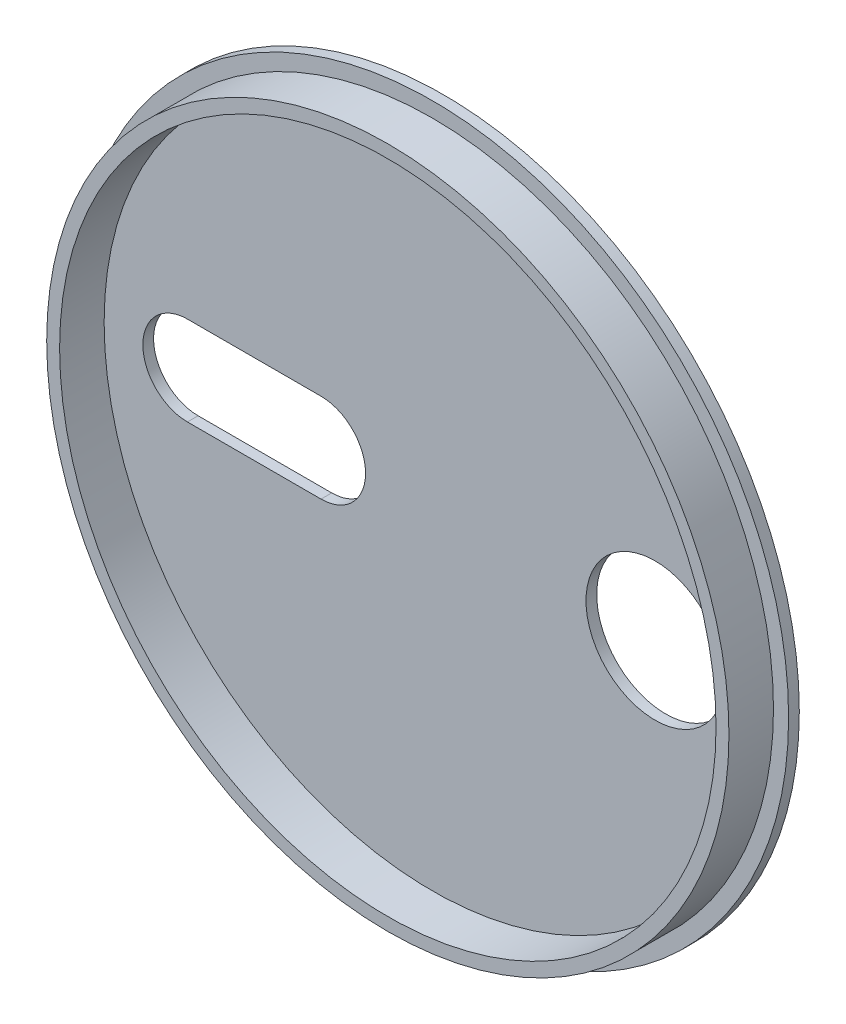
ISO-10303-21;
HEADER;
FILE_DESCRIPTION(('STEP AP214'),'2;1');
FILE_NAME('part.step','',(''),(''),'','','');
FILE_SCHEMA(('AUTOMOTIVE_DESIGN { 1 0 10303 214 1 1 1 1 }'));
ENDSEC;
DATA;
#1=APPLICATION_CONTEXT('core data for automotive mechanical design processes');
#2=APPLICATION_PROTOCOL_DEFINITION('international standard','automotive_design',2000,#1);
#3=PRODUCT_CONTEXT('',#1,'mechanical');
#4=PRODUCT('Part','Part','',(#3));
#5=PRODUCT_RELATED_PRODUCT_CATEGORY('part','',(#4));
#6=PRODUCT_DEFINITION_FORMATION('','',#4);
#7=PRODUCT_DEFINITION_CONTEXT('part definition',#1,'design');
#8=PRODUCT_DEFINITION('design','',#6,#7);
#9=PRODUCT_DEFINITION_SHAPE('','',#8);
#10=(LENGTH_UNIT() NAMED_UNIT(*) SI_UNIT(.MILLI.,.METRE.));
#11=(NAMED_UNIT(*) PLANE_ANGLE_UNIT() SI_UNIT($,.RADIAN.));
#12=(NAMED_UNIT(*) SI_UNIT($,.STERADIAN.) SOLID_ANGLE_UNIT());
#13=UNCERTAINTY_MEASURE_WITH_UNIT(LENGTH_MEASURE(1.E-05),#10,'distance_accuracy_value','');
#14=(GEOMETRIC_REPRESENTATION_CONTEXT(3) GLOBAL_UNCERTAINTY_ASSIGNED_CONTEXT((#13)) GLOBAL_UNIT_ASSIGNED_CONTEXT((#10,
#11,#12)) REPRESENTATION_CONTEXT('',''));
#15=CARTESIAN_POINT('',(0.,0.,0.));
#16=DIRECTION('',(0.,0.,1.));
#17=DIRECTION('',(1.,0.,0.));
#18=AXIS2_PLACEMENT_3D('',#15,#16,#17);
#19=CARTESIAN_POINT('',(0.,0.,1.2));
#20=DIRECTION('',(0.,0.,-1.));
#21=DIRECTION('',(-1.,0.,0.));
#22=AXIS2_PLACEMENT_3D('',#19,#20,#21);
#23=CYLINDRICAL_SURFACE('',#22,40.);
#24=CARTESIAN_POINT('',(0.,0.,1.2));
#25=DIRECTION('',(0.,0.,1.));
#26=DIRECTION('',(1.,0.,0.));
#27=AXIS2_PLACEMENT_3D('',#24,#25,#26);
#28=CIRCLE('',#27,40.);
#29=CARTESIAN_POINT('',(40.,0.,1.2));
#30=VERTEX_POINT('',#29);
#31=EDGE_CURVE('E11',#30,#30,#28,.T.);
#32=ORIENTED_EDGE('',*,*,#31,.F.);
#33=EDGE_LOOP('',(#32));
#34=FACE_BOUND('',#33,.T.);
#35=CARTESIAN_POINT('',(0.,0.,0.));
#36=DIRECTION('',(0.,0.,1.));
#37=DIRECTION('',(1.,0.,0.));
#38=AXIS2_PLACEMENT_3D('',#35,#36,#37);
#39=CIRCLE('',#38,40.);
#40=CARTESIAN_POINT('',(40.,0.,0.));
#41=VERTEX_POINT('',#40);
#42=EDGE_CURVE('E38',#41,#41,#39,.T.);
#43=ORIENTED_EDGE('',*,*,#42,.T.);
#44=EDGE_LOOP('',(#43));
#45=FACE_BOUND('',#44,.T.);
#46=ADVANCED_FACE('F35',(#34,#45),#23,.T.);
#47=CARTESIAN_POINT('',(0.,0.,1.2));
#48=DIRECTION('',(0.,0.,1.));
#49=DIRECTION('',(1.,0.,0.));
#50=AXIS2_PLACEMENT_3D('',#47,#48,#49);
#51=PLANE('',#50);
#52=CARTESIAN_POINT('',(0.,0.,1.2));
#53=DIRECTION('',(0.,0.,1.));
#54=DIRECTION('',(1.,0.,0.));
#55=AXIS2_PLACEMENT_3D('',#52,#53,#54);
#56=CIRCLE('',#55,38.3);
#57=CARTESIAN_POINT('',(38.3,0.,1.2));
#58=VERTEX_POINT('',#57);
#59=EDGE_CURVE('E233',#58,#58,#56,.T.);
#60=ORIENTED_EDGE('',*,*,#59,.F.);
#61=EDGE_LOOP('',(#60));
#62=FACE_BOUND('',#61,.T.);
#63=ORIENTED_EDGE('',*,*,#31,.T.);
#64=EDGE_LOOP('',(#63));
#65=FACE_BOUND('',#64,.T.);
#66=ADVANCED_FACE('F117',(#62,#65),#51,.T.);
#67=CARTESIAN_POINT('',(0.,0.,0.));
#68=DIRECTION('',(0.,0.,1.));
#69=DIRECTION('',(1.,0.,0.));
#70=AXIS2_PLACEMENT_3D('',#67,#68,#69);
#71=PLANE('',#70);
#72=CARTESIAN_POINT('',(-27.5,0.,0.));
#73=DIRECTION('',(0.,0.,1.));
#74=DIRECTION('',(1.,0.,0.));
#75=AXIS2_PLACEMENT_3D('',#72,#73,#74);
#76=CIRCLE('',#75,5.);
#77=CARTESIAN_POINT('',(-27.5,-5.00000000000001,0.));
#78=VERTEX_POINT('',#77);
#79=CARTESIAN_POINT('',(-27.5,5.,0.));
#80=VERTEX_POINT('',#79);
#81=EDGE_CURVE('E240',#78,#80,#76,.F.);
#82=ORIENTED_EDGE('',*,*,#81,.F.);
#83=DIRECTION('',(-1.,0.,0.));
#84=VECTOR('',#83,1.);
#85=CARTESIAN_POINT('',(0.,-5.00000000000001,0.));
#86=LINE('',#85,#84);
#87=CARTESIAN_POINT('',(-12.5,-5.,0.));
#88=VERTEX_POINT('',#87);
#89=EDGE_CURVE('E91',#88,#78,#86,.T.);
#90=ORIENTED_EDGE('',*,*,#89,.F.);
#91=CARTESIAN_POINT('',(-12.5,0.,0.));
#92=DIRECTION('',(0.,0.,1.));
#93=DIRECTION('',(1.,0.,0.));
#94=AXIS2_PLACEMENT_3D('',#91,#92,#93);
#95=CIRCLE('',#94,5.);
#96=CARTESIAN_POINT('',(-12.5,5.,0.));
#97=VERTEX_POINT('',#96);
#98=EDGE_CURVE('E95',#97,#88,#95,.F.);
#99=ORIENTED_EDGE('',*,*,#98,.F.);
#100=DIRECTION('',(-1.,0.,0.));
#101=VECTOR('',#100,1.);
#102=CARTESIAN_POINT('',(0.,5.,0.));
#103=LINE('',#102,#101);
#104=EDGE_CURVE('E49',#97,#80,#103,.T.);
#105=ORIENTED_EDGE('',*,*,#104,.T.);
#106=EDGE_LOOP('',(#82,#90,#99,#105));
#107=FACE_BOUND('',#106,.T.);
#108=CARTESIAN_POINT('',(25.,0.,0.));
#109=DIRECTION('',(0.,0.,1.));
#110=DIRECTION('',(1.,0.,0.));
#111=AXIS2_PLACEMENT_3D('',#108,#109,#110);
#112=CIRCLE('',#111,7.75);
#113=CARTESIAN_POINT('',(32.75,0.,0.));
#114=VERTEX_POINT('',#113);
#115=EDGE_CURVE('E106',#114,#114,#112,.F.);
#116=ORIENTED_EDGE('',*,*,#115,.F.);
#117=EDGE_LOOP('',(#116));
#118=FACE_BOUND('',#117,.T.);
#119=ORIENTED_EDGE('',*,*,#42,.F.);
#120=EDGE_LOOP('',(#119));
#121=FACE_BOUND('',#120,.T.);
#122=ADVANCED_FACE('F114',(#107,#118,#121),#71,.F.);
#123=CARTESIAN_POINT('',(25.,0.,-0.000999999999999916));
#124=DIRECTION('',(0.,0.,1.));
#125=DIRECTION('',(1.,0.,0.));
#126=AXIS2_PLACEMENT_3D('',#123,#124,#125);
#127=CYLINDRICAL_SURFACE('',#126,7.75);
#128=CARTESIAN_POINT('',(25.,0.,1.2));
#129=DIRECTION('',(0.,0.,1.));
#130=DIRECTION('',(1.,0.,0.));
#131=AXIS2_PLACEMENT_3D('',#128,#129,#130);
#132=CIRCLE('',#131,7.75);
#133=CARTESIAN_POINT('',(32.75,0.,1.2));
#134=VERTEX_POINT('',#133);
#135=EDGE_CURVE('E228',#134,#134,#132,.F.);
#136=ORIENTED_EDGE('',*,*,#135,.F.);
#137=EDGE_LOOP('',(#136));
#138=FACE_BOUND('',#137,.T.);
#139=ORIENTED_EDGE('',*,*,#115,.T.);
#140=EDGE_LOOP('',(#139));
#141=FACE_BOUND('',#140,.T.);
#142=ADVANCED_FACE('F116',(#138,#141),#127,.F.);
#143=CARTESIAN_POINT('',(0.,-5.00000000000001,-0.000999999999999916));
#144=DIRECTION('',(0.,-1.,0.));
#145=DIRECTION('',(0.,0.,-1.));
#146=AXIS2_PLACEMENT_3D('',#143,#144,#145);
#147=PLANE('',#146);
#148=ORIENTED_EDGE('',*,*,#89,.T.);
#149=DIRECTION('',(0.,0.,1.));
#150=VECTOR('',#149,1.);
#151=CARTESIAN_POINT('',(-27.5,-5.00000000000001,-0.000999999999999916));
#152=LINE('',#151,#150);
#153=CARTESIAN_POINT('',(-27.5,-5.,1.2));
#154=VERTEX_POINT('',#153);
#155=EDGE_CURVE('E57',#78,#154,#152,.T.);
#156=ORIENTED_EDGE('',*,*,#155,.T.);
#157=DIRECTION('',(1.,0.,0.));
#158=VECTOR('',#157,1.);
#159=CARTESIAN_POINT('',(0.,-5.00000000000001,1.2));
#160=LINE('',#159,#158);
#161=CARTESIAN_POINT('',(-12.5,-5.,1.2));
#162=VERTEX_POINT('',#161);
#163=EDGE_CURVE('E81',#154,#162,#160,.T.);
#164=ORIENTED_EDGE('',*,*,#163,.T.);
#165=DIRECTION('',(0.,0.,1.));
#166=VECTOR('',#165,1.);
#167=CARTESIAN_POINT('',(-12.5,-5.00000000000001,-0.000999999999999916));
#168=LINE('',#167,#166);
#169=EDGE_CURVE('E89',#88,#162,#168,.T.);
#170=ORIENTED_EDGE('',*,*,#169,.F.);
#171=EDGE_LOOP('',(#148,#156,#164,#170));
#172=FACE_BOUND('',#171,.T.);
#173=ADVANCED_FACE('F88',(#172),#147,.F.);
#174=CARTESIAN_POINT('',(-27.5,0.,-0.000999999999999916));
#175=DIRECTION('',(0.,0.,1.));
#176=DIRECTION('',(1.,0.,0.));
#177=AXIS2_PLACEMENT_3D('',#174,#175,#176);
#178=CYLINDRICAL_SURFACE('',#177,5.);
#179=ORIENTED_EDGE('',*,*,#81,.T.);
#180=DIRECTION('',(0.,0.,1.));
#181=VECTOR('',#180,1.);
#182=CARTESIAN_POINT('',(-27.5,5.,-0.000999999999999916));
#183=LINE('',#182,#181);
#184=CARTESIAN_POINT('',(-27.5,5.,1.2));
#185=VERTEX_POINT('',#184);
#186=EDGE_CURVE('E100',#80,#185,#183,.T.);
#187=ORIENTED_EDGE('',*,*,#186,.T.);
#188=CARTESIAN_POINT('',(-27.5,0.,1.2));
#189=DIRECTION('',(0.,0.,1.));
#190=DIRECTION('',(1.,0.,0.));
#191=AXIS2_PLACEMENT_3D('',#188,#189,#190);
#192=CIRCLE('',#191,5.);
#193=EDGE_CURVE('E98',#185,#154,#192,.T.);
#194=ORIENTED_EDGE('',*,*,#193,.T.);
#195=ORIENTED_EDGE('',*,*,#155,.F.);
#196=EDGE_LOOP('',(#179,#187,#194,#195));
#197=FACE_BOUND('',#196,.T.);
#198=ADVANCED_FACE('F166',(#197),#178,.F.);
#199=CARTESIAN_POINT('',(0.,5.,-0.000999999999999916));
#200=DIRECTION('',(0.,-1.,0.));
#201=DIRECTION('',(0.,0.,-1.));
#202=AXIS2_PLACEMENT_3D('',#199,#200,#201);
#203=PLANE('',#202);
#204=DIRECTION('',(0.,0.,1.));
#205=VECTOR('',#204,1.);
#206=CARTESIAN_POINT('',(-12.5,5.,-0.000999999999999916));
#207=LINE('',#206,#205);
#208=CARTESIAN_POINT('',(-12.5,5.,1.2));
#209=VERTEX_POINT('',#208);
#210=EDGE_CURVE('E97',#97,#209,#207,.T.);
#211=ORIENTED_EDGE('',*,*,#210,.T.);
#212=DIRECTION('',(1.,0.,0.));
#213=VECTOR('',#212,1.);
#214=CARTESIAN_POINT('',(0.,5.,1.2));
#215=LINE('',#214,#213);
#216=EDGE_CURVE('E83',#185,#209,#215,.T.);
#217=ORIENTED_EDGE('',*,*,#216,.F.);
#218=ORIENTED_EDGE('',*,*,#186,.F.);
#219=ORIENTED_EDGE('',*,*,#104,.F.);
#220=EDGE_LOOP('',(#211,#217,#218,#219));
#221=FACE_BOUND('',#220,.T.);
#222=ADVANCED_FACE('F176',(#221),#203,.T.);
#223=CARTESIAN_POINT('',(-12.5,0.,-0.000999999999999916));
#224=DIRECTION('',(0.,0.,1.));
#225=DIRECTION('',(1.,0.,0.));
#226=AXIS2_PLACEMENT_3D('',#223,#224,#225);
#227=CYLINDRICAL_SURFACE('',#226,5.);
#228=ORIENTED_EDGE('',*,*,#98,.T.);
#229=ORIENTED_EDGE('',*,*,#169,.T.);
#230=CARTESIAN_POINT('',(-12.5,0.,1.2));
#231=DIRECTION('',(0.,0.,1.));
#232=DIRECTION('',(1.,0.,0.));
#233=AXIS2_PLACEMENT_3D('',#230,#231,#232);
#234=CIRCLE('',#233,5.);
#235=EDGE_CURVE('E77',#162,#209,#234,.T.);
#236=ORIENTED_EDGE('',*,*,#235,.T.);
#237=ORIENTED_EDGE('',*,*,#210,.F.);
#238=EDGE_LOOP('',(#228,#229,#236,#237));
#239=FACE_BOUND('',#238,.T.);
#240=ADVANCED_FACE('F93',(#239),#227,.F.);
#241=CARTESIAN_POINT('',(0.,0.,6.2));
#242=DIRECTION('',(0.,0.,-1.));
#243=DIRECTION('',(-1.,0.,0.));
#244=AXIS2_PLACEMENT_3D('',#241,#242,#243);
#245=CYLINDRICAL_SURFACE('',#244,38.3);
#246=CARTESIAN_POINT('',(0.,0.,6.2));
#247=DIRECTION('',(0.,0.,1.));
#248=DIRECTION('',(1.,0.,0.));
#249=AXIS2_PLACEMENT_3D('',#246,#247,#248);
#250=CIRCLE('',#249,38.3);
#251=CARTESIAN_POINT('',(38.3,0.,6.2));
#252=VERTEX_POINT('',#251);
#253=EDGE_CURVE('E234',#252,#252,#250,.T.);
#254=ORIENTED_EDGE('',*,*,#253,.F.);
#255=EDGE_LOOP('',(#254));
#256=FACE_BOUND('',#255,.T.);
#257=ORIENTED_EDGE('',*,*,#59,.T.);
#258=EDGE_LOOP('',(#257));
#259=FACE_BOUND('',#258,.T.);
#260=ADVANCED_FACE('F147',(#256,#259),#245,.T.);
#261=CARTESIAN_POINT('',(0.,0.,6.2));
#262=DIRECTION('',(0.,0.,1.));
#263=DIRECTION('',(1.,0.,0.));
#264=AXIS2_PLACEMENT_3D('',#261,#262,#263);
#265=PLANE('',#264);
#266=CARTESIAN_POINT('',(0.,0.,6.2));
#267=DIRECTION('',(0.,0.,1.));
#268=DIRECTION('',(1.,0.,0.));
#269=AXIS2_PLACEMENT_3D('',#266,#267,#268);
#270=CIRCLE('',#269,36.85);
#271=CARTESIAN_POINT('',(36.85,0.,6.2));
#272=VERTEX_POINT('',#271);
#273=EDGE_CURVE('E226',#272,#272,#270,.T.);
#274=ORIENTED_EDGE('',*,*,#273,.F.);
#275=EDGE_LOOP('',(#274));
#276=FACE_BOUND('',#275,.T.);
#277=ORIENTED_EDGE('',*,*,#253,.T.);
#278=EDGE_LOOP('',(#277));
#279=FACE_BOUND('',#278,.T.);
#280=ADVANCED_FACE('F152',(#276,#279),#265,.T.);
#281=CARTESIAN_POINT('',(0.,0.,1.2));
#282=DIRECTION('',(0.,0.,1.));
#283=DIRECTION('',(1.,0.,0.));
#284=AXIS2_PLACEMENT_3D('',#281,#282,#283);
#285=PLANE('',#284);
#286=CARTESIAN_POINT('',(0.,0.,1.2));
#287=DIRECTION('',(0.,0.,1.));
#288=DIRECTION('',(1.,0.,0.));
#289=AXIS2_PLACEMENT_3D('',#286,#287,#288);
#290=CIRCLE('',#289,36.85);
#291=CARTESIAN_POINT('',(36.85,0.,1.2));
#292=VERTEX_POINT('',#291);
#293=EDGE_CURVE('E223',#292,#292,#290,.T.);
#294=ORIENTED_EDGE('',*,*,#293,.T.);
#295=EDGE_LOOP('',(#294));
#296=FACE_BOUND('',#295,.T.);
#297=ORIENTED_EDGE('',*,*,#163,.F.);
#298=ORIENTED_EDGE('',*,*,#193,.F.);
#299=ORIENTED_EDGE('',*,*,#216,.T.);
#300=ORIENTED_EDGE('',*,*,#235,.F.);
#301=EDGE_LOOP('',(#297,#298,#299,#300));
#302=FACE_BOUND('',#301,.T.);
#303=ORIENTED_EDGE('',*,*,#135,.T.);
#304=EDGE_LOOP('',(#303));
#305=FACE_BOUND('',#304,.T.);
#306=ADVANCED_FACE('F79',(#296,#302,#305),#285,.T.);
#307=CARTESIAN_POINT('',(0.,0.,1.2));
#308=DIRECTION('',(0.,0.,1.));
#309=DIRECTION('',(1.,0.,0.));
#310=AXIS2_PLACEMENT_3D('',#307,#308,#309);
#311=CYLINDRICAL_SURFACE('',#310,36.85);
#312=ORIENTED_EDGE('',*,*,#293,.F.);
#313=EDGE_LOOP('',(#312));
#314=FACE_BOUND('',#313,.T.);
#315=ORIENTED_EDGE('',*,*,#273,.T.);
#316=EDGE_LOOP('',(#315));
#317=FACE_BOUND('',#316,.T.);
#318=ADVANCED_FACE('F206',(#314,#317),#311,.F.);
#319=CLOSED_SHELL('',(#46,#66,#122,#142,#173,#198,#222,#240,#260,#280,#306,#318));
#320=MANIFOLD_SOLID_BREP('B2',#319);
#321=ADVANCED_BREP_SHAPE_REPRESENTATION('',(#18,#320),#14);
#322=SHAPE_DEFINITION_REPRESENTATION(#9,#321);
ENDSEC;
END-ISO-10303-21;
